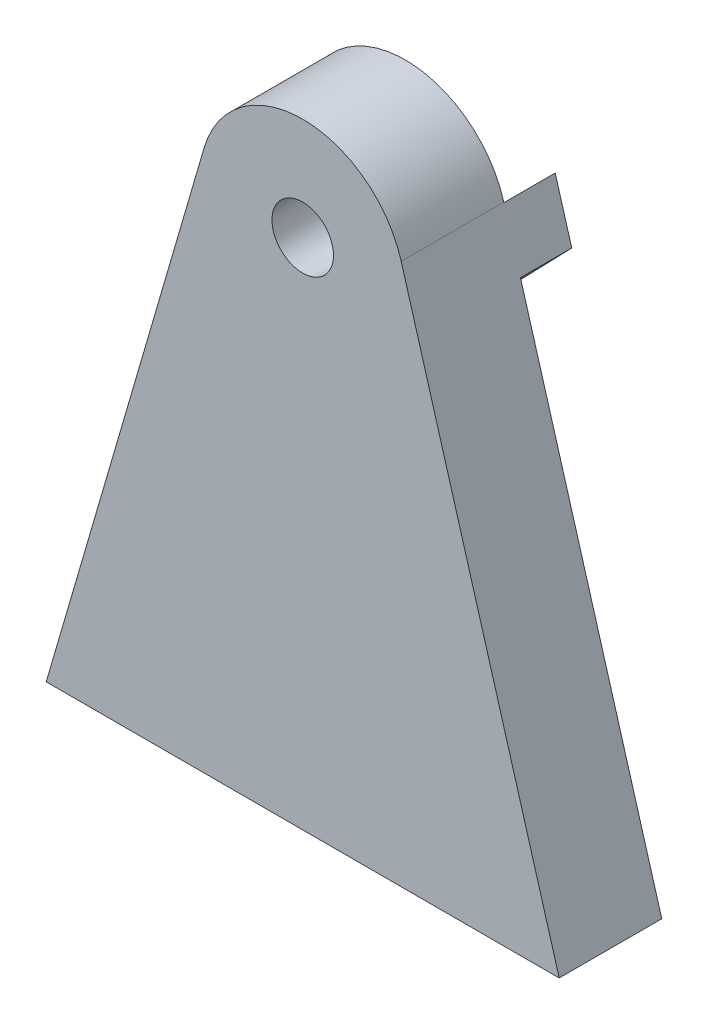
ISO-10303-21;
HEADER;
FILE_DESCRIPTION(('STEP AP214'),'2;1');
FILE_NAME('part.step','',(''),(''),'','','');
FILE_SCHEMA(('AUTOMOTIVE_DESIGN { 1 0 10303 214 1 1 1 1 }'));
ENDSEC;
DATA;
#1=APPLICATION_CONTEXT('core data for automotive mechanical design processes');
#2=APPLICATION_PROTOCOL_DEFINITION('international standard','automotive_design',2000,#1);
#3=PRODUCT_CONTEXT('',#1,'mechanical');
#4=PRODUCT('Part','Part','',(#3));
#5=PRODUCT_RELATED_PRODUCT_CATEGORY('part','',(#4));
#6=PRODUCT_DEFINITION_FORMATION('','',#4);
#7=PRODUCT_DEFINITION_CONTEXT('part definition',#1,'design');
#8=PRODUCT_DEFINITION('design','',#6,#7);
#9=PRODUCT_DEFINITION_SHAPE('','',#8);
#10=(LENGTH_UNIT() NAMED_UNIT(*) SI_UNIT(.MILLI.,.METRE.));
#11=(NAMED_UNIT(*) PLANE_ANGLE_UNIT() SI_UNIT($,.RADIAN.));
#12=(NAMED_UNIT(*) SI_UNIT($,.STERADIAN.) SOLID_ANGLE_UNIT());
#13=UNCERTAINTY_MEASURE_WITH_UNIT(LENGTH_MEASURE(1.E-05),#10,'distance_accuracy_value','');
#14=(GEOMETRIC_REPRESENTATION_CONTEXT(3) GLOBAL_UNCERTAINTY_ASSIGNED_CONTEXT((#13)) GLOBAL_UNIT_ASSIGNED_CONTEXT((#10,
#11,#12)) REPRESENTATION_CONTEXT('',''));
#15=CARTESIAN_POINT('',(0.,0.,0.));
#16=DIRECTION('',(0.,0.,1.));
#17=DIRECTION('',(1.,0.,0.));
#18=AXIS2_PLACEMENT_3D('',#15,#16,#17);
#19=CARTESIAN_POINT('',(-6.35,12.7,2.54));
#20=DIRECTION('',(0.,0.,-1.));
#21=DIRECTION('',(-1.,0.,0.));
#22=AXIS2_PLACEMENT_3D('',#19,#20,#21);
#23=CYLINDRICAL_SURFACE('',#22,2.54);
#24=CARTESIAN_POINT('',(-6.35,12.7,0.));
#25=DIRECTION('',(0.,0.,1.));
#26=DIRECTION('',(1.,0.,0.));
#27=AXIS2_PLACEMENT_3D('',#24,#25,#26);
#28=CIRCLE('',#27,2.54);
#29=CARTESIAN_POINT('',(-3.9116,13.4112,0.));
#30=VERTEX_POINT('',#29);
#31=CARTESIAN_POINT('',(-8.7884,13.4112,0.));
#32=VERTEX_POINT('',#31);
#33=EDGE_CURVE('E151',#30,#32,#28,.T.);
#34=ORIENTED_EDGE('',*,*,#33,.T.);
#35=DIRECTION('',(0.,0.,-1.));
#36=VECTOR('',#35,1.);
#37=CARTESIAN_POINT('',(-8.7884,13.4112,2.54));
#38=LINE('',#37,#36);
#39=CARTESIAN_POINT('',(-8.7884,13.4112,2.54));
#40=VERTEX_POINT('',#39);
#41=EDGE_CURVE('E191',#40,#32,#38,.T.);
#42=ORIENTED_EDGE('',*,*,#41,.F.);
#43=CARTESIAN_POINT('',(-6.35,12.7,2.54));
#44=DIRECTION('',(0.,0.,1.));
#45=DIRECTION('',(1.,0.,0.));
#46=AXIS2_PLACEMENT_3D('',#43,#44,#45);
#47=CIRCLE('',#46,2.54);
#48=CARTESIAN_POINT('',(-3.9116,13.4112,2.54));
#49=VERTEX_POINT('',#48);
#50=EDGE_CURVE('E157',#49,#40,#47,.T.);
#51=ORIENTED_EDGE('',*,*,#50,.F.);
#52=DIRECTION('',(0.,0.,-1.));
#53=VECTOR('',#52,1.);
#54=CARTESIAN_POINT('',(-3.9116,13.4112,2.54));
#55=LINE('',#54,#53);
#56=EDGE_CURVE('E168',#49,#30,#55,.T.);
#57=ORIENTED_EDGE('',*,*,#56,.T.);
#58=EDGE_LOOP('',(#34,#42,#51,#57));
#59=FACE_BOUND('',#58,.T.);
#60=ADVANCED_FACE('F38',(#59),#23,.T.);
#61=CARTESIAN_POINT('',(-8.7884,13.4112,2.54));
#62=DIRECTION('',(0.96,-0.28,0.));
#63=DIRECTION('',(0.28,0.96,0.));
#64=AXIS2_PLACEMENT_3D('',#61,#62,#63);
#65=PLANE('',#64);
#66=DIRECTION('',(-0.28,-0.96,0.));
#67=VECTOR('',#66,1.);
#68=CARTESIAN_POINT('',(-8.7884,13.4112,0.));
#69=LINE('',#68,#67);
#70=CARTESIAN_POINT('',(-12.7,0.,0.));
#71=VERTEX_POINT('',#70);
#72=EDGE_CURVE('E172',#32,#71,#69,.T.);
#73=ORIENTED_EDGE('',*,*,#72,.T.);
#74=DIRECTION('',(0.,0.,-1.));
#75=VECTOR('',#74,1.);
#76=CARTESIAN_POINT('',(-12.7,0.,2.54));
#77=LINE('',#76,#75);
#78=CARTESIAN_POINT('',(-12.7,0.,2.54));
#79=VERTEX_POINT('',#78);
#80=EDGE_CURVE('E187',#79,#71,#77,.T.);
#81=ORIENTED_EDGE('',*,*,#80,.F.);
#82=DIRECTION('',(-0.28,-0.96,0.));
#83=VECTOR('',#82,1.);
#84=CARTESIAN_POINT('',(-8.7884,13.4112,2.54));
#85=LINE('',#84,#83);
#86=EDGE_CURVE('E91',#40,#79,#85,.T.);
#87=ORIENTED_EDGE('',*,*,#86,.F.);
#88=ORIENTED_EDGE('',*,*,#41,.T.);
#89=EDGE_LOOP('',(#73,#81,#87,#88));
#90=FACE_BOUND('',#89,.T.);
#91=ADVANCED_FACE('F208',(#90),#65,.F.);
#92=CARTESIAN_POINT('',(-12.7,0.,2.54));
#93=DIRECTION('',(0.,1.,0.));
#94=DIRECTION('',(0.,0.,1.));
#95=AXIS2_PLACEMENT_3D('',#92,#93,#94);
#96=PLANE('',#95);
#97=DIRECTION('',(1.,0.,0.));
#98=VECTOR('',#97,1.);
#99=CARTESIAN_POINT('',(-12.7,0.,0.));
#100=LINE('',#99,#98);
#101=CARTESIAN_POINT('',(0.,0.,0.));
#102=VERTEX_POINT('',#101);
#103=EDGE_CURVE('E175',#71,#102,#100,.T.);
#104=ORIENTED_EDGE('',*,*,#103,.T.);
#105=DIRECTION('',(0.,0.,-1.));
#106=VECTOR('',#105,1.);
#107=CARTESIAN_POINT('',(0.,0.,2.54));
#108=LINE('',#107,#106);
#109=CARTESIAN_POINT('',(0.,0.,2.54));
#110=VERTEX_POINT('',#109);
#111=EDGE_CURVE('E183',#110,#102,#108,.T.);
#112=ORIENTED_EDGE('',*,*,#111,.F.);
#113=DIRECTION('',(1.,0.,0.));
#114=VECTOR('',#113,1.);
#115=CARTESIAN_POINT('',(-12.7,0.,2.54));
#116=LINE('',#115,#114);
#117=EDGE_CURVE('E163',#79,#110,#116,.T.);
#118=ORIENTED_EDGE('',*,*,#117,.F.);
#119=ORIENTED_EDGE('',*,*,#80,.T.);
#120=EDGE_LOOP('',(#104,#112,#118,#119));
#121=FACE_BOUND('',#120,.T.);
#122=ADVANCED_FACE('F206',(#121),#96,.F.);
#123=CARTESIAN_POINT('',(0.,0.,2.54));
#124=DIRECTION('',(-0.96,-0.28,0.));
#125=DIRECTION('',(0.28,-0.96,0.));
#126=AXIS2_PLACEMENT_3D('',#123,#124,#125);
#127=PLANE('',#126);
#128=DIRECTION('',(-0.28,0.96,0.));
#129=VECTOR('',#128,1.);
#130=CARTESIAN_POINT('',(0.,0.,0.));
#131=LINE('',#130,#129);
#132=CARTESIAN_POINT('',(-3.49883241542263,11.9959968528776,0.));
#133=VERTEX_POINT('',#132);
#134=EDGE_CURVE('E160',#102,#133,#131,.T.);
#135=ORIENTED_EDGE('',*,*,#134,.T.);
#136=DIRECTION('',(0.,0.,1.));
#137=VECTOR('',#136,1.);
#138=CARTESIAN_POINT('',(-3.49883241542263,11.9959968528776,-1.27));
#139=LINE('',#138,#137);
#140=CARTESIAN_POINT('',(-3.49883241542263,11.9959968528776,-1.27));
#141=VERTEX_POINT('',#140);
#142=EDGE_CURVE('E53',#141,#133,#139,.T.);
#143=ORIENTED_EDGE('',*,*,#142,.F.);
#144=DIRECTION('',(-0.28,0.96,0.));
#145=VECTOR('',#144,1.);
#146=CARTESIAN_POINT('',(-3.90837433691954,13.4001405837241,-1.27));
#147=LINE('',#146,#145);
#148=CARTESIAN_POINT('',(-3.90837433691954,13.4001405837241,-1.27));
#149=VERTEX_POINT('',#148);
#150=EDGE_CURVE('E130',#141,#149,#147,.T.);
#151=ORIENTED_EDGE('',*,*,#150,.T.);
#152=DIRECTION('',(0.,0.,1.));
#153=VECTOR('',#152,1.);
#154=CARTESIAN_POINT('',(-3.90837433691954,13.4001405837241,-1.27));
#155=LINE('',#154,#153);
#156=CARTESIAN_POINT('',(-3.90837433691954,13.4001405837241,0.));
#157=VERTEX_POINT('',#156);
#158=EDGE_CURVE('E152',#149,#157,#155,.T.);
#159=ORIENTED_EDGE('',*,*,#158,.T.);
#160=EDGE_CURVE('E83',#157,#30,#131,.T.);
#161=ORIENTED_EDGE('',*,*,#160,.T.);
#162=ORIENTED_EDGE('',*,*,#56,.F.);
#163=DIRECTION('',(-0.28,0.96,0.));
#164=VECTOR('',#163,1.);
#165=CARTESIAN_POINT('',(0.,0.,2.54));
#166=LINE('',#165,#164);
#167=EDGE_CURVE('E62',#110,#49,#166,.T.);
#168=ORIENTED_EDGE('',*,*,#167,.F.);
#169=ORIENTED_EDGE('',*,*,#111,.T.);
#170=EDGE_LOOP('',(#135,#143,#151,#159,#161,#162,#168,#169));
#171=FACE_BOUND('',#170,.T.);
#172=ADVANCED_FACE('F201',(#171),#127,.F.);
#173=CARTESIAN_POINT('',(-6.35,12.7,2.54));
#174=DIRECTION('',(0.,0.,1.));
#175=DIRECTION('',(1.,0.,0.));
#176=AXIS2_PLACEMENT_3D('',#173,#174,#175);
#177=PLANE('',#176);
#178=CARTESIAN_POINT('',(-6.35,12.7,2.54));
#179=DIRECTION('',(0.,0.,1.));
#180=DIRECTION('',(1.,0.,0.));
#181=AXIS2_PLACEMENT_3D('',#178,#179,#180);
#182=CIRCLE('',#181,0.761999999999999);
#183=CARTESIAN_POINT('',(-5.588,12.7,2.54));
#184=VERTEX_POINT('',#183);
#185=EDGE_CURVE('E141',#184,#184,#182,.T.);
#186=ORIENTED_EDGE('',*,*,#185,.F.);
#187=EDGE_LOOP('',(#186));
#188=FACE_BOUND('',#187,.T.);
#189=ORIENTED_EDGE('',*,*,#167,.T.);
#190=ORIENTED_EDGE('',*,*,#50,.T.);
#191=ORIENTED_EDGE('',*,*,#86,.T.);
#192=ORIENTED_EDGE('',*,*,#117,.T.);
#193=EDGE_LOOP('',(#189,#190,#191,#192));
#194=FACE_BOUND('',#193,.T.);
#195=ADVANCED_FACE('F213',(#188,#194),#177,.T.);
#196=CARTESIAN_POINT('',(-6.35,12.7,0.));
#197=DIRECTION('',(0.,0.,1.));
#198=DIRECTION('',(1.,0.,0.));
#199=AXIS2_PLACEMENT_3D('',#196,#197,#198);
#200=PLANE('',#199);
#201=CARTESIAN_POINT('',(-6.35,12.7,0.));
#202=DIRECTION('',(0.,0.,1.));
#203=DIRECTION('',(1.,0.,0.));
#204=AXIS2_PLACEMENT_3D('',#201,#202,#203);
#205=CIRCLE('',#204,0.761999999999999);
#206=CARTESIAN_POINT('',(-5.588,12.7,0.));
#207=VERTEX_POINT('',#206);
#208=EDGE_CURVE('E137',#207,#207,#205,.T.);
#209=ORIENTED_EDGE('',*,*,#208,.T.);
#210=EDGE_LOOP('',(#209));
#211=FACE_BOUND('',#210,.T.);
#212=ORIENTED_EDGE('',*,*,#160,.F.);
#213=DIRECTION('',(-0.694658370458996,-0.719339800338652,0.));
#214=VECTOR('',#213,1.);
#215=CARTESIAN_POINT('',(-5.43643845356991,11.8177838695171,0.));
#216=LINE('',#215,#214);
#217=CARTESIAN_POINT('',(-6.31865458405284,10.904222323087,0.));
#218=VERTEX_POINT('',#217);
#219=EDGE_CURVE('E11',#157,#218,#216,.T.);
#220=ORIENTED_EDGE('',*,*,#219,.T.);
#221=DIRECTION('',(0.719339800338652,-0.694658370458996,0.));
#222=VECTOR('',#221,1.);
#223=CARTESIAN_POINT('',(-7.23221613048292,11.7864384535699,0.));
#224=LINE('',#223,#222);
#225=CARTESIAN_POINT('',(-5.40509303762275,10.0220061926041,0.));
#226=VERTEX_POINT('',#225);
#227=EDGE_CURVE('E46',#218,#226,#224,.T.);
#228=ORIENTED_EDGE('',*,*,#227,.T.);
#229=DIRECTION('',(0.694658370458996,0.719339800338652,0.));
#230=VECTOR('',#229,1.);
#231=CARTESIAN_POINT('',(-4.52287690713982,10.9355677390342,0.));
#232=LINE('',#231,#230);
#233=EDGE_CURVE('E115',#226,#133,#232,.T.);
#234=ORIENTED_EDGE('',*,*,#233,.T.);
#235=ORIENTED_EDGE('',*,*,#134,.F.);
#236=ORIENTED_EDGE('',*,*,#103,.F.);
#237=ORIENTED_EDGE('',*,*,#72,.F.);
#238=ORIENTED_EDGE('',*,*,#33,.F.);
#239=EDGE_LOOP('',(#212,#220,#228,#234,#235,#236,#237,#238));
#240=FACE_BOUND('',#239,.T.);
#241=ADVANCED_FACE('F197',(#211,#240),#200,.F.);
#242=CARTESIAN_POINT('',(-6.31865458405284,10.904222323087,-1.27));
#243=DIRECTION('',(-0.694658370458996,-0.719339800338652,0.));
#244=DIRECTION('',(0.719339800338652,-0.694658370458996,0.));
#245=AXIS2_PLACEMENT_3D('',#242,#243,#244);
#246=PLANE('',#245);
#247=ORIENTED_EDGE('',*,*,#227,.F.);
#248=DIRECTION('',(0.,0.,1.));
#249=VECTOR('',#248,1.);
#250=CARTESIAN_POINT('',(-6.31865458405284,10.904222323087,-1.27));
#251=LINE('',#250,#249);
#252=CARTESIAN_POINT('',(-6.31865458405284,10.904222323087,-1.27));
#253=VERTEX_POINT('',#252);
#254=EDGE_CURVE('E135',#253,#218,#251,.T.);
#255=ORIENTED_EDGE('',*,*,#254,.F.);
#256=DIRECTION('',(0.719339800338652,-0.694658370458996,0.));
#257=VECTOR('',#256,1.);
#258=CARTESIAN_POINT('',(-6.31865458405284,10.904222323087,-1.27));
#259=LINE('',#258,#257);
#260=CARTESIAN_POINT('',(-5.40509303762275,10.0220061926041,-1.27));
#261=VERTEX_POINT('',#260);
#262=EDGE_CURVE('E127',#253,#261,#259,.T.);
#263=ORIENTED_EDGE('',*,*,#262,.T.);
#264=DIRECTION('',(0.,0.,1.));
#265=VECTOR('',#264,1.);
#266=CARTESIAN_POINT('',(-5.40509303762275,10.0220061926041,-1.27));
#267=LINE('',#266,#265);
#268=EDGE_CURVE('E111',#261,#226,#267,.T.);
#269=ORIENTED_EDGE('',*,*,#268,.T.);
#270=EDGE_LOOP('',(#247,#255,#263,#269));
#271=FACE_BOUND('',#270,.T.);
#272=ADVANCED_FACE('F133',(#271),#246,.T.);
#273=CARTESIAN_POINT('',(-6.31865458405284,10.904222323087,-1.27));
#274=DIRECTION('',(-0.719339800338652,0.694658370458996,0.));
#275=DIRECTION('',(-0.694658370458996,-0.719339800338652,0.));
#276=AXIS2_PLACEMENT_3D('',#273,#274,#275);
#277=PLANE('',#276);
#278=ORIENTED_EDGE('',*,*,#219,.F.);
#279=ORIENTED_EDGE('',*,*,#158,.F.);
#280=DIRECTION('',(-0.694658370458996,-0.719339800338652,0.));
#281=VECTOR('',#280,1.);
#282=CARTESIAN_POINT('',(-6.31865458405284,10.904222323087,-1.27));
#283=LINE('',#282,#281);
#284=EDGE_CURVE('E120',#149,#253,#283,.T.);
#285=ORIENTED_EDGE('',*,*,#284,.T.);
#286=ORIENTED_EDGE('',*,*,#254,.T.);
#287=EDGE_LOOP('',(#278,#279,#285,#286));
#288=FACE_BOUND('',#287,.T.);
#289=ADVANCED_FACE('F200',(#288),#277,.T.);
#290=CARTESIAN_POINT('',(-5.40509303762275,10.0220061926041,-1.27));
#291=DIRECTION('',(0.719339800338652,-0.694658370458996,0.));
#292=DIRECTION('',(0.694658370458996,0.719339800338652,0.));
#293=AXIS2_PLACEMENT_3D('',#290,#291,#292);
#294=PLANE('',#293);
#295=ORIENTED_EDGE('',*,*,#233,.F.);
#296=ORIENTED_EDGE('',*,*,#268,.F.);
#297=DIRECTION('',(0.694658370458996,0.719339800338652,0.));
#298=VECTOR('',#297,1.);
#299=CARTESIAN_POINT('',(-5.40509303762275,10.0220061926041,-1.27));
#300=LINE('',#299,#298);
#301=EDGE_CURVE('E114',#261,#141,#300,.T.);
#302=ORIENTED_EDGE('',*,*,#301,.T.);
#303=ORIENTED_EDGE('',*,*,#142,.T.);
#304=EDGE_LOOP('',(#295,#296,#302,#303));
#305=FACE_BOUND('',#304,.T.);
#306=ADVANCED_FACE('F113',(#305),#294,.T.);
#307=CARTESIAN_POINT('',(0.,0.,-1.27));
#308=DIRECTION('',(0.,0.,1.));
#309=DIRECTION('',(1.,0.,0.));
#310=AXIS2_PLACEMENT_3D('',#307,#308,#309);
#311=PLANE('',#310);
#312=ORIENTED_EDGE('',*,*,#262,.F.);
#313=ORIENTED_EDGE('',*,*,#284,.F.);
#314=ORIENTED_EDGE('',*,*,#150,.F.);
#315=ORIENTED_EDGE('',*,*,#301,.F.);
#316=EDGE_LOOP('',(#312,#313,#314,#315));
#317=FACE_BOUND('',#316,.T.);
#318=ADVANCED_FACE('F125',(#317),#311,.F.);
#319=CARTESIAN_POINT('',(-6.35,12.7,0.));
#320=DIRECTION('',(0.,0.,1.));
#321=DIRECTION('',(1.,0.,0.));
#322=AXIS2_PLACEMENT_3D('',#319,#320,#321);
#323=CYLINDRICAL_SURFACE('',#322,0.761999999999999);
#324=ORIENTED_EDGE('',*,*,#208,.F.);
#325=EDGE_LOOP('',(#324));
#326=FACE_BOUND('',#325,.T.);
#327=ORIENTED_EDGE('',*,*,#185,.T.);
#328=EDGE_LOOP('',(#327));
#329=FACE_BOUND('',#328,.T.);
#330=ADVANCED_FACE('F275',(#326,#329),#323,.F.);
#331=CLOSED_SHELL('',(#60,#91,#122,#172,#195,#241,#272,#289,#306,#318,#330));
#332=MANIFOLD_SOLID_BREP('B2',#331);
#333=ADVANCED_BREP_SHAPE_REPRESENTATION('',(#18,#332),#14);
#334=SHAPE_DEFINITION_REPRESENTATION(#9,#333);
ENDSEC;
END-ISO-10303-21;
